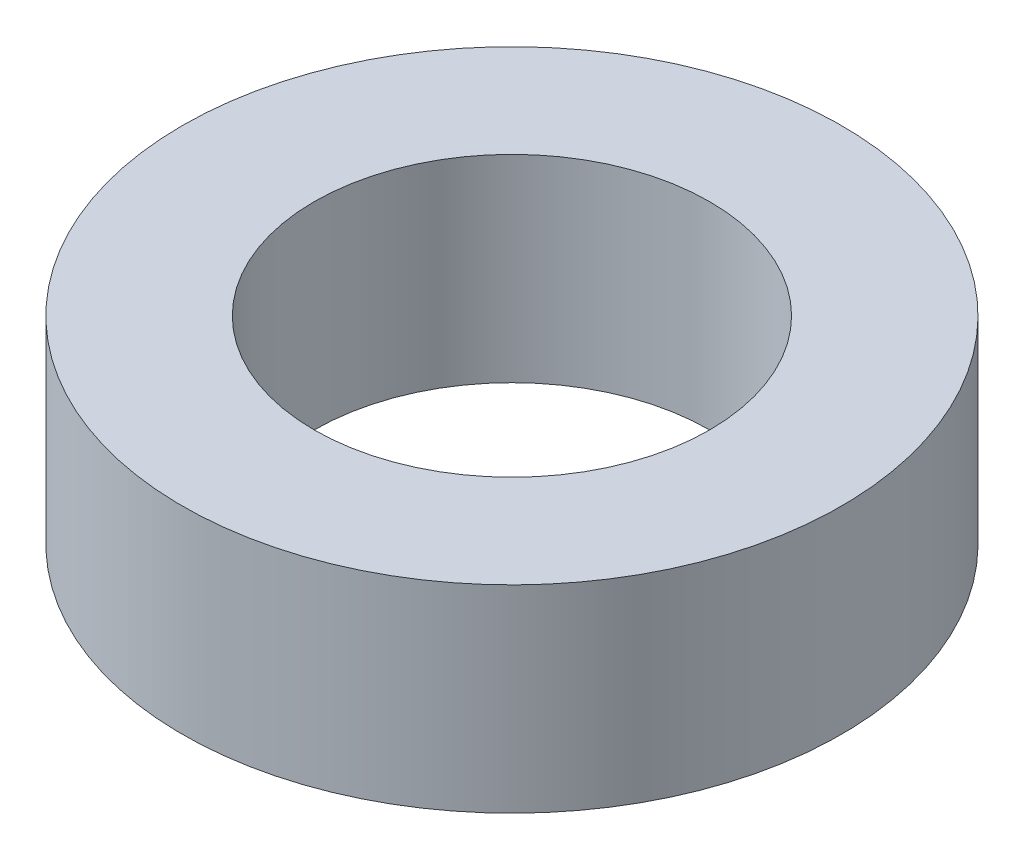
ISO-10303-21;
HEADER;
FILE_DESCRIPTION(('STEP AP214'),'2;1');
FILE_NAME('part.step','',(''),(''),'','','');
FILE_SCHEMA(('AUTOMOTIVE_DESIGN { 1 0 10303 214 1 1 1 1 }'));
ENDSEC;
DATA;
#1=APPLICATION_CONTEXT('core data for automotive mechanical design processes');
#2=APPLICATION_PROTOCOL_DEFINITION('international standard','automotive_design',2000,#1);
#3=PRODUCT_CONTEXT('',#1,'mechanical');
#4=PRODUCT('Part','Part','',(#3));
#5=PRODUCT_RELATED_PRODUCT_CATEGORY('part','',(#4));
#6=PRODUCT_DEFINITION_FORMATION('','',#4);
#7=PRODUCT_DEFINITION_CONTEXT('part definition',#1,'design');
#8=PRODUCT_DEFINITION('design','',#6,#7);
#9=PRODUCT_DEFINITION_SHAPE('','',#8);
#10=(LENGTH_UNIT() NAMED_UNIT(*) SI_UNIT(.MILLI.,.METRE.));
#11=(NAMED_UNIT(*) PLANE_ANGLE_UNIT() SI_UNIT($,.RADIAN.));
#12=(NAMED_UNIT(*) SI_UNIT($,.STERADIAN.) SOLID_ANGLE_UNIT());
#13=UNCERTAINTY_MEASURE_WITH_UNIT(LENGTH_MEASURE(1.E-05),#10,'distance_accuracy_value','');
#14=(GEOMETRIC_REPRESENTATION_CONTEXT(3) GLOBAL_UNCERTAINTY_ASSIGNED_CONTEXT((#13)) GLOBAL_UNIT_ASSIGNED_CONTEXT((#10,
#11,#12)) REPRESENTATION_CONTEXT('',''));
#15=CARTESIAN_POINT('',(0.,0.,0.));
#16=DIRECTION('',(0.,0.,1.));
#17=DIRECTION('',(1.,0.,0.));
#18=AXIS2_PLACEMENT_3D('',#15,#16,#17);
#19=CARTESIAN_POINT('',(0.,15.6727272727273,0.));
#20=DIRECTION('',(0.,1.,0.));
#21=DIRECTION('',(-1.,0.,0.));
#22=AXIS2_PLACEMENT_3D('',#19,#20,#21);
#23=CYLINDRICAL_SURFACE('',#22,15.);
#24=CARTESIAN_POINT('',(0.,7.50000000000001,0.));
#25=DIRECTION('',(0.,1.,0.));
#26=DIRECTION('',(-1.,0.,0.));
#27=AXIS2_PLACEMENT_3D('',#24,#25,#26);
#28=CIRCLE('',#27,15.);
#29=CARTESIAN_POINT('',(-15.,7.5,0.));
#30=VERTEX_POINT('',#29);
#31=EDGE_CURVE('E10',#30,#30,#28,.T.);
#32=ORIENTED_EDGE('',*,*,#31,.T.);
#33=EDGE_LOOP('',(#32));
#34=FACE_BOUND('',#33,.T.);
#35=CARTESIAN_POINT('',(0.,-7.5,0.));
#36=DIRECTION('',(0.,1.,0.));
#37=DIRECTION('',(-1.,0.,0.));
#38=AXIS2_PLACEMENT_3D('',#35,#36,#37);
#39=CIRCLE('',#38,15.);
#40=CARTESIAN_POINT('',(-15.,-7.5,0.));
#41=VERTEX_POINT('',#40);
#42=EDGE_CURVE('E49',#41,#41,#39,.T.);
#43=ORIENTED_EDGE('',*,*,#42,.F.);
#44=EDGE_LOOP('',(#43));
#45=FACE_BOUND('',#44,.T.);
#46=ADVANCED_FACE('F35',(#34,#45),#23,.F.);
#47=CARTESIAN_POINT('',(-25.,7.5,0.));
#48=DIRECTION('',(0.,1.,0.));
#49=DIRECTION('',(-1.,0.,0.));
#50=AXIS2_PLACEMENT_3D('',#47,#48,#49);
#51=PLANE('',#50);
#52=CARTESIAN_POINT('',(0.,7.50000000000001,0.));
#53=DIRECTION('',(0.,1.,0.));
#54=DIRECTION('',(-1.,0.,0.));
#55=AXIS2_PLACEMENT_3D('',#52,#53,#54);
#56=CIRCLE('',#55,25.);
#57=CARTESIAN_POINT('',(-25.,7.5,0.));
#58=VERTEX_POINT('',#57);
#59=EDGE_CURVE('E41',#58,#58,#56,.T.);
#60=ORIENTED_EDGE('',*,*,#59,.T.);
#61=EDGE_LOOP('',(#60));
#62=FACE_BOUND('',#61,.T.);
#63=ORIENTED_EDGE('',*,*,#31,.F.);
#64=EDGE_LOOP('',(#63));
#65=FACE_BOUND('',#64,.T.);
#66=ADVANCED_FACE('F59',(#62,#65),#51,.T.);
#67=CARTESIAN_POINT('',(0.,15.6727272727273,0.));
#68=DIRECTION('',(0.,1.,0.));
#69=DIRECTION('',(-1.,0.,0.));
#70=AXIS2_PLACEMENT_3D('',#67,#68,#69);
#71=CYLINDRICAL_SURFACE('',#70,25.);
#72=CARTESIAN_POINT('',(0.,-7.49999999999999,0.));
#73=DIRECTION('',(0.,1.,0.));
#74=DIRECTION('',(-1.,0.,0.));
#75=AXIS2_PLACEMENT_3D('',#72,#73,#74);
#76=CIRCLE('',#75,25.);
#77=CARTESIAN_POINT('',(-25.,-7.5,0.));
#78=VERTEX_POINT('',#77);
#79=EDGE_CURVE('E45',#78,#78,#76,.T.);
#80=ORIENTED_EDGE('',*,*,#79,.T.);
#81=EDGE_LOOP('',(#80));
#82=FACE_BOUND('',#81,.T.);
#83=ORIENTED_EDGE('',*,*,#59,.F.);
#84=EDGE_LOOP('',(#83));
#85=FACE_BOUND('',#84,.T.);
#86=ADVANCED_FACE('F63',(#82,#85),#71,.T.);
#87=CARTESIAN_POINT('',(-25.,-7.5,0.));
#88=DIRECTION('',(0.,-1.,0.));
#89=DIRECTION('',(1.,0.,0.));
#90=AXIS2_PLACEMENT_3D('',#87,#88,#89);
#91=PLANE('',#90);
#92=ORIENTED_EDGE('',*,*,#42,.T.);
#93=EDGE_LOOP('',(#92));
#94=FACE_BOUND('',#93,.T.);
#95=ORIENTED_EDGE('',*,*,#79,.F.);
#96=EDGE_LOOP('',(#95));
#97=FACE_BOUND('',#96,.T.);
#98=ADVANCED_FACE('F55',(#94,#97),#91,.T.);
#99=CLOSED_SHELL('',(#46,#66,#86,#98));
#100=MANIFOLD_SOLID_BREP('B2',#99);
#101=ADVANCED_BREP_SHAPE_REPRESENTATION('',(#18,#100),#14);
#102=SHAPE_DEFINITION_REPRESENTATION(#9,#101);
ENDSEC;
END-ISO-10303-21;
